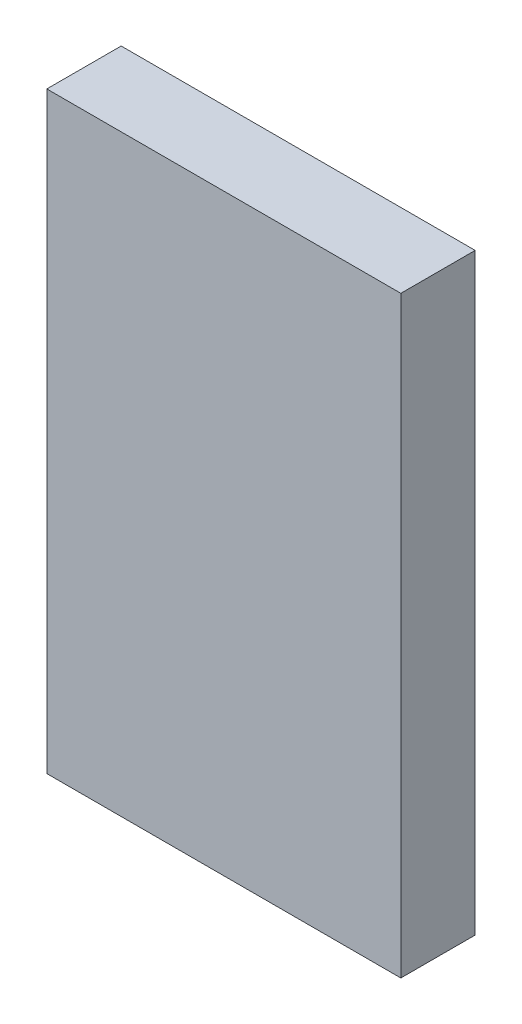
ISO-10303-21;
HEADER;
FILE_DESCRIPTION(('STEP AP214'),'2;1');
FILE_NAME('part.step','',(''),(''),'','','');
FILE_SCHEMA(('AUTOMOTIVE_DESIGN { 1 0 10303 214 1 1 1 1 }'));
ENDSEC;
DATA;
#1=APPLICATION_CONTEXT('core data for automotive mechanical design processes');
#2=APPLICATION_PROTOCOL_DEFINITION('international standard','automotive_design',2000,#1);
#3=PRODUCT_CONTEXT('',#1,'mechanical');
#4=PRODUCT('Part','Part','',(#3));
#5=PRODUCT_RELATED_PRODUCT_CATEGORY('part','',(#4));
#6=PRODUCT_DEFINITION_FORMATION('','',#4);
#7=PRODUCT_DEFINITION_CONTEXT('part definition',#1,'design');
#8=PRODUCT_DEFINITION('design','',#6,#7);
#9=PRODUCT_DEFINITION_SHAPE('','',#8);
#10=(LENGTH_UNIT() NAMED_UNIT(*) SI_UNIT(.MILLI.,.METRE.));
#11=(NAMED_UNIT(*) PLANE_ANGLE_UNIT() SI_UNIT($,.RADIAN.));
#12=(NAMED_UNIT(*) SI_UNIT($,.STERADIAN.) SOLID_ANGLE_UNIT());
#13=UNCERTAINTY_MEASURE_WITH_UNIT(LENGTH_MEASURE(1.E-05),#10,'distance_accuracy_value','');
#14=(GEOMETRIC_REPRESENTATION_CONTEXT(3) GLOBAL_UNCERTAINTY_ASSIGNED_CONTEXT((#13)) GLOBAL_UNIT_ASSIGNED_CONTEXT((#10,
#11,#12)) REPRESENTATION_CONTEXT('',''));
#15=CARTESIAN_POINT('',(0.,0.,0.));
#16=DIRECTION('',(0.,0.,1.));
#17=DIRECTION('',(1.,0.,0.));
#18=AXIS2_PLACEMENT_3D('',#15,#16,#17);
#19=CARTESIAN_POINT('',(-7.69230769230769,4.76923076923077,4.2));
#20=DIRECTION('',(1.,0.,0.));
#21=DIRECTION('',(0.,1.,0.));
#22=AXIS2_PLACEMENT_3D('',#19,#20,#21);
#23=PLANE('',#22);
#24=DIRECTION('',(0.,-1.,0.));
#25=VECTOR('',#24,1.);
#26=CARTESIAN_POINT('',(-7.69230769230769,4.76923076923077,0.));
#27=LINE('',#26,#25);
#28=CARTESIAN_POINT('',(-7.69230769230769,4.76923076923077,0.));
#29=VERTEX_POINT('',#28);
#30=CARTESIAN_POINT('',(-7.69230769230769,-28.7307692307692,0.));
#31=VERTEX_POINT('',#30);
#32=EDGE_CURVE('E97',#29,#31,#27,.T.);
#33=ORIENTED_EDGE('',*,*,#32,.T.);
#34=DIRECTION('',(0.,0.,-1.));
#35=VECTOR('',#34,1.);
#36=CARTESIAN_POINT('',(-7.69230769230769,-28.7307692307692,4.2));
#37=LINE('',#36,#35);
#38=CARTESIAN_POINT('',(-7.69230769230769,-28.7307692307692,4.2));
#39=VERTEX_POINT('',#38);
#40=EDGE_CURVE('E11',#39,#31,#37,.T.);
#41=ORIENTED_EDGE('',*,*,#40,.F.);
#42=DIRECTION('',(0.,-1.,0.));
#43=VECTOR('',#42,1.);
#44=CARTESIAN_POINT('',(-7.69230769230769,4.76923076923077,4.2));
#45=LINE('',#44,#43);
#46=CARTESIAN_POINT('',(-7.69230769230769,4.76923076923077,4.2));
#47=VERTEX_POINT('',#46);
#48=EDGE_CURVE('E85',#47,#39,#45,.T.);
#49=ORIENTED_EDGE('',*,*,#48,.F.);
#50=DIRECTION('',(0.,0.,-1.));
#51=VECTOR('',#50,1.);
#52=CARTESIAN_POINT('',(-7.69230769230769,4.76923076923077,4.2));
#53=LINE('',#52,#51);
#54=EDGE_CURVE('E93',#47,#29,#53,.T.);
#55=ORIENTED_EDGE('',*,*,#54,.T.);
#56=EDGE_LOOP('',(#33,#41,#49,#55));
#57=FACE_BOUND('',#56,.T.);
#58=ADVANCED_FACE('F34',(#57),#23,.F.);
#59=CARTESIAN_POINT('',(-7.69230769230769,-28.7307692307692,4.2));
#60=DIRECTION('',(0.,1.,0.));
#61=DIRECTION('',(0.,0.,1.));
#62=AXIS2_PLACEMENT_3D('',#59,#60,#61);
#63=PLANE('',#62);
#64=DIRECTION('',(1.,0.,0.));
#65=VECTOR('',#64,1.);
#66=CARTESIAN_POINT('',(-7.69230769230769,-28.7307692307692,0.));
#67=LINE('',#66,#65);
#68=CARTESIAN_POINT('',(12.3076923076923,-28.7307692307692,0.));
#69=VERTEX_POINT('',#68);
#70=EDGE_CURVE('E89',#31,#69,#67,.T.);
#71=ORIENTED_EDGE('',*,*,#70,.T.);
#72=DIRECTION('',(0.,0.,-1.));
#73=VECTOR('',#72,1.);
#74=CARTESIAN_POINT('',(12.3076923076923,-28.7307692307692,4.2));
#75=LINE('',#74,#73);
#76=CARTESIAN_POINT('',(12.3076923076923,-28.7307692307692,4.2));
#77=VERTEX_POINT('',#76);
#78=EDGE_CURVE('E42',#77,#69,#75,.T.);
#79=ORIENTED_EDGE('',*,*,#78,.F.);
#80=DIRECTION('',(1.,0.,0.));
#81=VECTOR('',#80,1.);
#82=CARTESIAN_POINT('',(-7.69230769230769,-28.7307692307692,4.2));
#83=LINE('',#82,#81);
#84=EDGE_CURVE('E80',#39,#77,#83,.T.);
#85=ORIENTED_EDGE('',*,*,#84,.F.);
#86=ORIENTED_EDGE('',*,*,#40,.T.);
#87=EDGE_LOOP('',(#71,#79,#85,#86));
#88=FACE_BOUND('',#87,.T.);
#89=ADVANCED_FACE('F88',(#88),#63,.F.);
#90=CARTESIAN_POINT('',(12.3076923076923,4.76923076923077,4.2));
#91=DIRECTION('',(-1.,0.,0.));
#92=DIRECTION('',(0.,-1.,0.));
#93=AXIS2_PLACEMENT_3D('',#90,#91,#92);
#94=PLANE('',#93);
#95=DIRECTION('',(0.,1.,0.));
#96=VECTOR('',#95,1.);
#97=CARTESIAN_POINT('',(12.3076923076923,4.76923076923077,0.));
#98=LINE('',#97,#96);
#99=CARTESIAN_POINT('',(12.3076923076923,4.76923076923077,0.));
#100=VERTEX_POINT('',#99);
#101=EDGE_CURVE('E67',#69,#100,#98,.T.);
#102=ORIENTED_EDGE('',*,*,#101,.T.);
#103=DIRECTION('',(0.,0.,-1.));
#104=VECTOR('',#103,1.);
#105=CARTESIAN_POINT('',(12.3076923076923,4.76923076923077,4.2));
#106=LINE('',#105,#104);
#107=CARTESIAN_POINT('',(12.3076923076923,4.76923076923077,4.2));
#108=VERTEX_POINT('',#107);
#109=EDGE_CURVE('E90',#108,#100,#106,.T.);
#110=ORIENTED_EDGE('',*,*,#109,.F.);
#111=DIRECTION('',(0.,1.,0.));
#112=VECTOR('',#111,1.);
#113=CARTESIAN_POINT('',(12.3076923076923,4.76923076923077,4.2));
#114=LINE('',#113,#112);
#115=EDGE_CURVE('E83',#77,#108,#114,.T.);
#116=ORIENTED_EDGE('',*,*,#115,.F.);
#117=ORIENTED_EDGE('',*,*,#78,.T.);
#118=EDGE_LOOP('',(#102,#110,#116,#117));
#119=FACE_BOUND('',#118,.T.);
#120=ADVANCED_FACE('F91',(#119),#94,.F.);
#121=CARTESIAN_POINT('',(-7.69230769230769,4.76923076923077,4.2));
#122=DIRECTION('',(0.,-1.,0.));
#123=DIRECTION('',(0.,0.,-1.));
#124=AXIS2_PLACEMENT_3D('',#121,#122,#123);
#125=PLANE('',#124);
#126=DIRECTION('',(-1.,0.,0.));
#127=VECTOR('',#126,1.);
#128=CARTESIAN_POINT('',(-7.69230769230769,4.76923076923077,0.));
#129=LINE('',#128,#127);
#130=EDGE_CURVE('E73',#100,#29,#129,.T.);
#131=ORIENTED_EDGE('',*,*,#130,.T.);
#132=ORIENTED_EDGE('',*,*,#54,.F.);
#133=DIRECTION('',(-1.,0.,0.));
#134=VECTOR('',#133,1.);
#135=CARTESIAN_POINT('',(-7.69230769230769,4.76923076923077,4.2));
#136=LINE('',#135,#134);
#137=EDGE_CURVE('E50',#108,#47,#136,.T.);
#138=ORIENTED_EDGE('',*,*,#137,.F.);
#139=ORIENTED_EDGE('',*,*,#109,.T.);
#140=EDGE_LOOP('',(#131,#132,#138,#139));
#141=FACE_BOUND('',#140,.T.);
#142=ADVANCED_FACE('F104',(#141),#125,.F.);
#143=CARTESIAN_POINT('',(0.,0.,4.2));
#144=DIRECTION('',(0.,0.,1.));
#145=DIRECTION('',(1.,0.,0.));
#146=AXIS2_PLACEMENT_3D('',#143,#144,#145);
#147=PLANE('',#146);
#148=ORIENTED_EDGE('',*,*,#48,.T.);
#149=ORIENTED_EDGE('',*,*,#84,.T.);
#150=ORIENTED_EDGE('',*,*,#115,.T.);
#151=ORIENTED_EDGE('',*,*,#137,.T.);
#152=EDGE_LOOP('',(#148,#149,#150,#151));
#153=FACE_BOUND('',#152,.T.);
#154=ADVANCED_FACE('F81',(#153),#147,.T.);
#155=CARTESIAN_POINT('',(0.,0.,0.));
#156=DIRECTION('',(0.,0.,1.));
#157=DIRECTION('',(1.,0.,0.));
#158=AXIS2_PLACEMENT_3D('',#155,#156,#157);
#159=PLANE('',#158);
#160=ORIENTED_EDGE('',*,*,#32,.F.);
#161=ORIENTED_EDGE('',*,*,#130,.F.);
#162=ORIENTED_EDGE('',*,*,#101,.F.);
#163=ORIENTED_EDGE('',*,*,#70,.F.);
#164=EDGE_LOOP('',(#160,#161,#162,#163));
#165=FACE_BOUND('',#164,.T.);
#166=ADVANCED_FACE('F107',(#165),#159,.F.);
#167=CLOSED_SHELL('',(#58,#89,#120,#142,#154,#166));
#168=MANIFOLD_SOLID_BREP('B2',#167);
#169=ADVANCED_BREP_SHAPE_REPRESENTATION('',(#18,#168),#14);
#170=SHAPE_DEFINITION_REPRESENTATION(#9,#169);
ENDSEC;
END-ISO-10303-21;
